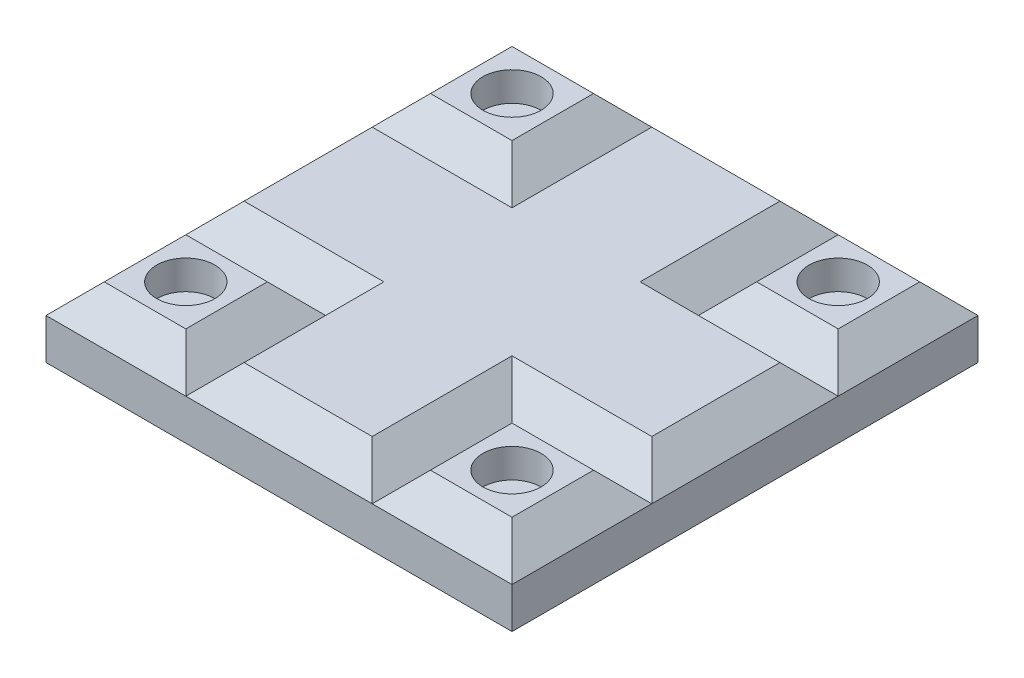
ISO-10303-21;
HEADER;
FILE_DESCRIPTION(('STEP AP214'),'2;1');
FILE_NAME('part.step','',(''),(''),'','','');
FILE_SCHEMA(('AUTOMOTIVE_DESIGN { 1 0 10303 214 1 1 1 1 }'));
ENDSEC;
DATA;
#1=APPLICATION_CONTEXT('core data for automotive mechanical design processes');
#2=APPLICATION_PROTOCOL_DEFINITION('international standard','automotive_design',2000,#1);
#3=PRODUCT_CONTEXT('',#1,'mechanical');
#4=PRODUCT('Part','Part','',(#3));
#5=PRODUCT_RELATED_PRODUCT_CATEGORY('part','',(#4));
#6=PRODUCT_DEFINITION_FORMATION('','',#4);
#7=PRODUCT_DEFINITION_CONTEXT('part definition',#1,'design');
#8=PRODUCT_DEFINITION('design','',#6,#7);
#9=PRODUCT_DEFINITION_SHAPE('','',#8);
#10=(LENGTH_UNIT() NAMED_UNIT(*) SI_UNIT(.MILLI.,.METRE.));
#11=(NAMED_UNIT(*) PLANE_ANGLE_UNIT() SI_UNIT($,.RADIAN.));
#12=(NAMED_UNIT(*) SI_UNIT($,.STERADIAN.) SOLID_ANGLE_UNIT());
#13=UNCERTAINTY_MEASURE_WITH_UNIT(LENGTH_MEASURE(1.E-05),#10,'distance_accuracy_value','');
#14=(GEOMETRIC_REPRESENTATION_CONTEXT(3) GLOBAL_UNCERTAINTY_ASSIGNED_CONTEXT((#13)) GLOBAL_UNIT_ASSIGNED_CONTEXT((#10,
#11,#12)) REPRESENTATION_CONTEXT('',''));
#15=CARTESIAN_POINT('',(0.,0.,0.));
#16=DIRECTION('',(0.,0.,1.));
#17=DIRECTION('',(1.,0.,0.));
#18=AXIS2_PLACEMENT_3D('',#15,#16,#17);
#19=CARTESIAN_POINT('',(-20.,6.,20.));
#20=DIRECTION('',(0.,0.,-1.));
#21=DIRECTION('',(-1.,0.,0.));
#22=AXIS2_PLACEMENT_3D('',#19,#20,#21);
#23=PLANE('',#22);
#24=DIRECTION('',(0.,-1.,0.));
#25=VECTOR('',#24,1.);
#26=CARTESIAN_POINT('',(20.,6.,20.));
#27=LINE('',#26,#25);
#28=CARTESIAN_POINT('',(20.,3.50000000000004,20.));
#29=VERTEX_POINT('',#28);
#30=CARTESIAN_POINT('',(20.,0.,20.));
#31=VERTEX_POINT('',#30);
#32=EDGE_CURVE('E271',#29,#31,#27,.T.);
#33=ORIENTED_EDGE('',*,*,#32,.F.);
#34=DIRECTION('',(-1.,0.,0.));
#35=VECTOR('',#34,1.);
#36=CARTESIAN_POINT('',(7.99999999999985,3.50000000000004,20.));
#37=LINE('',#36,#35);
#38=CARTESIAN_POINT('',(7.99999999999985,3.5,20.0000000000001));
#39=VERTEX_POINT('',#38);
#40=EDGE_CURVE('E411',#29,#39,#37,.T.);
#41=ORIENTED_EDGE('',*,*,#40,.T.);
#42=DIRECTION('',(-1.,0.,0.));
#43=VECTOR('',#42,1.);
#44=CARTESIAN_POINT('',(-7.99999999999978,3.5,20.));
#45=LINE('',#44,#43);
#46=CARTESIAN_POINT('',(-7.99999999999978,3.5,20.));
#47=VERTEX_POINT('',#46);
#48=EDGE_CURVE('E319',#39,#47,#45,.T.);
#49=ORIENTED_EDGE('',*,*,#48,.T.);
#50=DIRECTION('',(-1.,0.,0.));
#51=VECTOR('',#50,1.);
#52=CARTESIAN_POINT('',(-20.0000000000001,3.5000000000001,20.));
#53=LINE('',#52,#51);
#54=CARTESIAN_POINT('',(-20.,3.5000000000001,20.));
#55=VERTEX_POINT('',#54);
#56=EDGE_CURVE('E375',#47,#55,#53,.T.);
#57=ORIENTED_EDGE('',*,*,#56,.T.);
#58=DIRECTION('',(0.,-1.,0.));
#59=VECTOR('',#58,1.);
#60=CARTESIAN_POINT('',(-20.,6.,20.));
#61=LINE('',#60,#59);
#62=CARTESIAN_POINT('',(-20.,0.,20.));
#63=VERTEX_POINT('',#62);
#64=EDGE_CURVE('E262',#55,#63,#61,.T.);
#65=ORIENTED_EDGE('',*,*,#64,.T.);
#66=DIRECTION('',(1.,0.,0.));
#67=VECTOR('',#66,1.);
#68=CARTESIAN_POINT('',(-20.,0.,20.));
#69=LINE('',#68,#67);
#70=EDGE_CURVE('E242',#63,#31,#69,.T.);
#71=ORIENTED_EDGE('',*,*,#70,.T.);
#72=EDGE_LOOP('',(#33,#41,#49,#57,#65,#71));
#73=FACE_BOUND('',#72,.T.);
#74=ADVANCED_FACE('F38',(#73),#23,.F.);
#75=CARTESIAN_POINT('',(20.,6.,20.));
#76=DIRECTION('',(-1.,0.,0.));
#77=DIRECTION('',(0.,0.,1.));
#78=AXIS2_PLACEMENT_3D('',#75,#76,#77);
#79=PLANE('',#78);
#80=DIRECTION('',(0.,-1.,0.));
#81=VECTOR('',#80,1.);
#82=CARTESIAN_POINT('',(20.,6.,-20.));
#83=LINE('',#82,#81);
#84=CARTESIAN_POINT('',(20.,3.50000000000008,-20.));
#85=VERTEX_POINT('',#84);
#86=CARTESIAN_POINT('',(20.,0.,-20.));
#87=VERTEX_POINT('',#86);
#88=EDGE_CURVE('E268',#85,#87,#83,.T.);
#89=ORIENTED_EDGE('',*,*,#88,.F.);
#90=DIRECTION('',(0.,0.,1.));
#91=VECTOR('',#90,1.);
#92=CARTESIAN_POINT('',(20.,3.50000000000008,-7.99999999999979));
#93=LINE('',#92,#91);
#94=CARTESIAN_POINT('',(20.,3.5,-7.99999999999992));
#95=VERTEX_POINT('',#94);
#96=EDGE_CURVE('E444',#85,#95,#93,.T.);
#97=ORIENTED_EDGE('',*,*,#96,.T.);
#98=DIRECTION('',(0.,0.,1.));
#99=VECTOR('',#98,1.);
#100=CARTESIAN_POINT('',(20.,3.5,7.99999999999978));
#101=LINE('',#100,#99);
#102=CARTESIAN_POINT('',(20.0000000000002,3.5,7.99999999999978));
#103=VERTEX_POINT('',#102);
#104=EDGE_CURVE('E316',#95,#103,#101,.T.);
#105=ORIENTED_EDGE('',*,*,#104,.T.);
#106=DIRECTION('',(0.,0.,1.));
#107=VECTOR('',#106,1.);
#108=CARTESIAN_POINT('',(20.,3.50000000000004,20.));
#109=LINE('',#108,#107);
#110=EDGE_CURVE('E408',#103,#29,#109,.T.);
#111=ORIENTED_EDGE('',*,*,#110,.T.);
#112=ORIENTED_EDGE('',*,*,#32,.T.);
#113=DIRECTION('',(0.,0.,-1.));
#114=VECTOR('',#113,1.);
#115=CARTESIAN_POINT('',(20.,0.,20.));
#116=LINE('',#115,#114);
#117=EDGE_CURVE('E247',#31,#87,#116,.T.);
#118=ORIENTED_EDGE('',*,*,#117,.T.);
#119=EDGE_LOOP('',(#89,#97,#105,#111,#112,#118));
#120=FACE_BOUND('',#119,.T.);
#121=ADVANCED_FACE('F611',(#120),#79,.F.);
#122=CARTESIAN_POINT('',(-20.,6.,-20.));
#123=DIRECTION('',(0.,0.,-1.));
#124=DIRECTION('',(-1.,0.,0.));
#125=AXIS2_PLACEMENT_3D('',#122,#123,#124);
#126=PLANE('',#125);
#127=DIRECTION('',(0.,-1.,0.));
#128=VECTOR('',#127,1.);
#129=CARTESIAN_POINT('',(-20.,6.,-20.));
#130=LINE('',#129,#128);
#131=CARTESIAN_POINT('',(-20.,3.49999999999993,-20.));
#132=VERTEX_POINT('',#131);
#133=CARTESIAN_POINT('',(-20.,0.,-20.));
#134=VERTEX_POINT('',#133);
#135=EDGE_CURVE('E265',#132,#134,#130,.T.);
#136=ORIENTED_EDGE('',*,*,#135,.F.);
#137=DIRECTION('',(1.,0.,0.));
#138=VECTOR('',#137,1.);
#139=CARTESIAN_POINT('',(-20.,3.49999999999993,-20.));
#140=LINE('',#139,#138);
#141=CARTESIAN_POINT('',(-7.99999999999999,3.5,-20.));
#142=VERTEX_POINT('',#141);
#143=EDGE_CURVE('E11',#132,#142,#140,.T.);
#144=ORIENTED_EDGE('',*,*,#143,.T.);
#145=DIRECTION('',(1.,0.,0.));
#146=VECTOR('',#145,1.);
#147=CARTESIAN_POINT('',(-20.,3.5,-20.));
#148=LINE('',#147,#146);
#149=CARTESIAN_POINT('',(8.00000000000008,3.5,-20.));
#150=VERTEX_POINT('',#149);
#151=EDGE_CURVE('E313',#142,#150,#148,.T.);
#152=ORIENTED_EDGE('',*,*,#151,.T.);
#153=DIRECTION('',(1.,0.,0.));
#154=VECTOR('',#153,1.);
#155=CARTESIAN_POINT('',(-20.,3.50000000000008,-20.));
#156=LINE('',#155,#154);
#157=EDGE_CURVE('E441',#150,#85,#156,.T.);
#158=ORIENTED_EDGE('',*,*,#157,.T.);
#159=ORIENTED_EDGE('',*,*,#88,.T.);
#160=DIRECTION('',(1.,0.,0.));
#161=VECTOR('',#160,1.);
#162=CARTESIAN_POINT('',(-20.,0.,-20.));
#163=LINE('',#162,#161);
#164=EDGE_CURVE('E254',#134,#87,#163,.T.);
#165=ORIENTED_EDGE('',*,*,#164,.F.);
#166=EDGE_LOOP('',(#136,#144,#152,#158,#159,#165));
#167=FACE_BOUND('',#166,.T.);
#168=ADVANCED_FACE('F626',(#167),#126,.T.);
#169=CARTESIAN_POINT('',(-20.,6.,20.));
#170=DIRECTION('',(-1.,0.,0.));
#171=DIRECTION('',(0.,0.,1.));
#172=AXIS2_PLACEMENT_3D('',#169,#170,#171);
#173=PLANE('',#172);
#174=DIRECTION('',(0.,0.,-1.));
#175=VECTOR('',#174,1.);
#176=CARTESIAN_POINT('',(-20.,3.5,20.));
#177=LINE('',#176,#175);
#178=CARTESIAN_POINT('',(-20.0000000000001,3.5,7.99999999999979));
#179=VERTEX_POINT('',#178);
#180=CARTESIAN_POINT('',(-20.,3.5,-8.00000000000001));
#181=VERTEX_POINT('',#180);
#182=EDGE_CURVE('E274',#179,#181,#177,.T.);
#183=ORIENTED_EDGE('',*,*,#182,.T.);
#184=DIRECTION('',(0.,0.,-1.));
#185=VECTOR('',#184,1.);
#186=CARTESIAN_POINT('',(-20.,3.49999999999993,20.));
#187=LINE('',#186,#185);
#188=EDGE_CURVE('E49',#181,#132,#187,.T.);
#189=ORIENTED_EDGE('',*,*,#188,.T.);
#190=ORIENTED_EDGE('',*,*,#135,.T.);
#191=DIRECTION('',(0.,0.,-1.));
#192=VECTOR('',#191,1.);
#193=CARTESIAN_POINT('',(-20.,0.,20.));
#194=LINE('',#193,#192);
#195=EDGE_CURVE('E258',#63,#134,#194,.T.);
#196=ORIENTED_EDGE('',*,*,#195,.F.);
#197=ORIENTED_EDGE('',*,*,#64,.F.);
#198=DIRECTION('',(0.,0.,-1.));
#199=VECTOR('',#198,1.);
#200=CARTESIAN_POINT('',(-20.,3.5000000000001,20.));
#201=LINE('',#200,#199);
#202=EDGE_CURVE('E378',#55,#179,#201,.T.);
#203=ORIENTED_EDGE('',*,*,#202,.T.);
#204=EDGE_LOOP('',(#183,#189,#190,#196,#197,#203));
#205=FACE_BOUND('',#204,.T.);
#206=ADVANCED_FACE('F622',(#205),#173,.T.);
#207=CARTESIAN_POINT('',(0.,6.,0.));
#208=DIRECTION('',(0.,1.,0.));
#209=DIRECTION('',(0.,0.,1.));
#210=AXIS2_PLACEMENT_3D('',#207,#208,#209);
#211=PLANE('',#210);
#212=DIRECTION('',(-1.,0.,0.));
#213=VECTOR('',#212,1.);
#214=CARTESIAN_POINT('',(-20.,6.,-5.5));
#215=LINE('',#214,#213);
#216=CARTESIAN_POINT('',(-5.49999999999998,6.,-5.5));
#217=VERTEX_POINT('',#216);
#218=CARTESIAN_POINT('',(-17.5,6.,-5.5));
#219=VERTEX_POINT('',#218);
#220=EDGE_CURVE('E230',#217,#219,#215,.T.);
#221=ORIENTED_EDGE('',*,*,#220,.T.);
#222=DIRECTION('',(0.,0.,1.));
#223=VECTOR('',#222,1.);
#224=CARTESIAN_POINT('',(-17.5,6.,0.));
#225=LINE('',#224,#223);
#226=CARTESIAN_POINT('',(-17.5,6.,5.4999999999998));
#227=VERTEX_POINT('',#226);
#228=EDGE_CURVE('E309',#219,#227,#225,.T.);
#229=ORIENTED_EDGE('',*,*,#228,.T.);
#230=DIRECTION('',(1.,0.,0.));
#231=VECTOR('',#230,1.);
#232=CARTESIAN_POINT('',(-8.00000000000007,6.,5.4999999999999));
#233=LINE('',#232,#231);
#234=CARTESIAN_POINT('',(-5.50000000000015,6.,5.49999999999993));
#235=VERTEX_POINT('',#234);
#236=EDGE_CURVE('E277',#227,#235,#233,.T.);
#237=ORIENTED_EDGE('',*,*,#236,.T.);
#238=DIRECTION('',(0.,0.,1.));
#239=VECTOR('',#238,1.);
#240=CARTESIAN_POINT('',(-5.49999999999977,6.,19.9999999999999));
#241=LINE('',#240,#239);
#242=CARTESIAN_POINT('',(-5.49999999999983,6.,17.5));
#243=VERTEX_POINT('',#242);
#244=EDGE_CURVE('E280',#235,#243,#241,.T.);
#245=ORIENTED_EDGE('',*,*,#244,.T.);
#246=DIRECTION('',(1.,0.,0.));
#247=VECTOR('',#246,1.);
#248=CARTESIAN_POINT('',(8.00000000000022,6.,17.5));
#249=LINE('',#248,#247);
#250=CARTESIAN_POINT('',(5.50000000000015,6.,17.5));
#251=VERTEX_POINT('',#250);
#252=EDGE_CURVE('E283',#243,#251,#249,.T.);
#253=ORIENTED_EDGE('',*,*,#252,.T.);
#254=DIRECTION('',(0.,0.,-1.));
#255=VECTOR('',#254,1.);
#256=CARTESIAN_POINT('',(5.49999999999993,6.,8.00000000000012));
#257=LINE('',#256,#255);
#258=CARTESIAN_POINT('',(5.49999999999987,6.,5.50000000000012));
#259=VERTEX_POINT('',#258);
#260=EDGE_CURVE('E286',#251,#259,#257,.T.);
#261=ORIENTED_EDGE('',*,*,#260,.T.);
#262=DIRECTION('',(1.,0.,0.));
#263=VECTOR('',#262,1.);
#264=CARTESIAN_POINT('',(19.9999999999999,6.,5.49999999999977));
#265=LINE('',#264,#263);
#266=CARTESIAN_POINT('',(17.5,6.,5.49999999999983));
#267=VERTEX_POINT('',#266);
#268=EDGE_CURVE('E289',#259,#267,#265,.T.);
#269=ORIENTED_EDGE('',*,*,#268,.T.);
#270=DIRECTION('',(0.,0.,-1.));
#271=VECTOR('',#270,1.);
#272=CARTESIAN_POINT('',(17.5,6.,-7.99999999999992));
#273=LINE('',#272,#271);
#274=CARTESIAN_POINT('',(17.5,6.,-5.49999999999992));
#275=VERTEX_POINT('',#274);
#276=EDGE_CURVE('E292',#267,#275,#273,.T.);
#277=ORIENTED_EDGE('',*,*,#276,.T.);
#278=DIRECTION('',(-1.,0.,0.));
#279=VECTOR('',#278,1.);
#280=CARTESIAN_POINT('',(8.00000000000003,6.,-5.49999999999995));
#281=LINE('',#280,#279);
#282=CARTESIAN_POINT('',(5.50000000000002,6.,-5.49999999999996));
#283=VERTEX_POINT('',#282);
#284=EDGE_CURVE('E295',#275,#283,#281,.T.);
#285=ORIENTED_EDGE('',*,*,#284,.T.);
#286=DIRECTION('',(0.,0.,-1.));
#287=VECTOR('',#286,1.);
#288=CARTESIAN_POINT('',(5.50000000000007,6.,-20.));
#289=LINE('',#288,#287);
#290=CARTESIAN_POINT('',(5.50000000000006,6.,-17.5));
#291=VERTEX_POINT('',#290);
#292=EDGE_CURVE('E298',#283,#291,#289,.T.);
#293=ORIENTED_EDGE('',*,*,#292,.T.);
#294=DIRECTION('',(-1.,0.,0.));
#295=VECTOR('',#294,1.);
#296=CARTESIAN_POINT('',(0.,6.,-17.5));
#297=LINE('',#296,#295);
#298=CARTESIAN_POINT('',(-5.49999999999998,6.,-17.5));
#299=VERTEX_POINT('',#298);
#300=EDGE_CURVE('E301',#291,#299,#297,.T.);
#301=ORIENTED_EDGE('',*,*,#300,.T.);
#302=DIRECTION('',(0.,0.,1.));
#303=VECTOR('',#302,1.);
#304=CARTESIAN_POINT('',(-5.49999999999998,6.,-8.00000000000001));
#305=LINE('',#304,#303);
#306=EDGE_CURVE('E304',#299,#217,#305,.T.);
#307=ORIENTED_EDGE('',*,*,#306,.T.);
#308=EDGE_LOOP('',(#221,#229,#237,#245,#253,#261,#269,#277,#285,#293,#301,#307));
#309=FACE_BOUND('',#308,.T.);
#310=ADVANCED_FACE('F779',(#309),#211,.T.);
#311=CARTESIAN_POINT('',(0.,0.,0.));
#312=DIRECTION('',(0.,1.,0.));
#313=DIRECTION('',(0.,0.,1.));
#314=AXIS2_PLACEMENT_3D('',#311,#312,#313);
#315=PLANE('',#314);
#316=ORIENTED_EDGE('',*,*,#70,.F.);
#317=ORIENTED_EDGE('',*,*,#195,.T.);
#318=ORIENTED_EDGE('',*,*,#164,.T.);
#319=ORIENTED_EDGE('',*,*,#117,.F.);
#320=EDGE_LOOP('',(#316,#317,#318,#319));
#321=FACE_BOUND('',#320,.T.);
#322=ADVANCED_FACE('F621',(#321),#315,.F.);
#323=CARTESIAN_POINT('',(17.5,6.,0.));
#324=DIRECTION('',(0.707106781186547,0.707106781186549,0.));
#325=DIRECTION('',(0.,0.,1.));
#326=AXIS2_PLACEMENT_3D('',#323,#324,#325);
#327=PLANE('',#326);
#328=DIRECTION('',(-0.577350269189627,0.577350269189625,0.577350269189625));
#329=VECTOR('',#328,1.);
#330=CARTESIAN_POINT('',(15.6666666666667,7.8333333333333,-3.66666666666662));
#331=LINE('',#330,#329);
#332=EDGE_CURVE('E354',#275,#95,#331,.F.);
#333=ORIENTED_EDGE('',*,*,#332,.F.);
#334=ORIENTED_EDGE('',*,*,#276,.F.);
#335=DIRECTION('',(-0.577350269189631,0.577350269189629,-0.577350269189618));
#336=VECTOR('',#335,1.);
#337=CARTESIAN_POINT('',(20.0000000000002,3.5,7.99999999999978));
#338=LINE('',#337,#336);
#339=EDGE_CURVE('E358',#103,#267,#338,.T.);
#340=ORIENTED_EDGE('',*,*,#339,.F.);
#341=ORIENTED_EDGE('',*,*,#104,.F.);
#342=EDGE_LOOP('',(#333,#334,#340,#341));
#343=FACE_BOUND('',#342,.T.);
#344=ADVANCED_FACE('F656',(#343),#327,.T.);
#345=CARTESIAN_POINT('',(20.0000000000002,3.5,7.99999999999978));
#346=DIRECTION('',(0.,0.707106781186549,0.707106781186546));
#347=DIRECTION('',(1.,0.,0.));
#348=AXIS2_PLACEMENT_3D('',#345,#346,#347);
#349=PLANE('',#348);
#350=ORIENTED_EDGE('',*,*,#339,.T.);
#351=ORIENTED_EDGE('',*,*,#268,.F.);
#352=DIRECTION('',(-0.57735026918964,0.577350269189624,-0.577350269189613));
#353=VECTOR('',#352,1.);
#354=CARTESIAN_POINT('',(12.0000000000001,-0.500000000000088,12.0000000000001));
#355=LINE('',#354,#353);
#356=CARTESIAN_POINT('',(7.99999999999994,3.5,8.00000000000007));
#357=VERTEX_POINT('',#356);
#358=EDGE_CURVE('E350',#357,#259,#355,.T.);
#359=ORIENTED_EDGE('',*,*,#358,.F.);
#360=DIRECTION('',(-1.,0.,0.));
#361=VECTOR('',#360,1.);
#362=CARTESIAN_POINT('',(20.0000000000002,3.5,7.99999999999978));
#363=LINE('',#362,#361);
#364=EDGE_CURVE('E516',#103,#357,#363,.T.);
#365=ORIENTED_EDGE('',*,*,#364,.F.);
#366=EDGE_LOOP('',(#350,#351,#359,#365));
#367=FACE_BOUND('',#366,.T.);
#368=ADVANCED_FACE('F659',(#367),#349,.T.);
#369=CARTESIAN_POINT('',(20.,3.5,-7.99999999999992));
#370=DIRECTION('',(0.,0.707106781186549,-0.707106781186546));
#371=DIRECTION('',(-1.,0.,0.));
#372=AXIS2_PLACEMENT_3D('',#369,#370,#371);
#373=PLANE('',#372);
#374=ORIENTED_EDGE('',*,*,#332,.T.);
#375=DIRECTION('',(1.,0.,0.));
#376=VECTOR('',#375,1.);
#377=CARTESIAN_POINT('',(20.,3.5,-7.99999999999992));
#378=LINE('',#377,#376);
#379=CARTESIAN_POINT('',(7.99999999999978,3.5,-7.99999999999979));
#380=VERTEX_POINT('',#379);
#381=EDGE_CURVE('E224',#380,#95,#378,.T.);
#382=ORIENTED_EDGE('',*,*,#381,.F.);
#383=DIRECTION('',(-0.577350269189629,0.577350269189624,0.577350269189625));
#384=VECTOR('',#383,1.);
#385=CARTESIAN_POINT('',(12.0000000000001,-0.499999999999994,-12.));
#386=LINE('',#385,#384);
#387=EDGE_CURVE('E346',#283,#380,#386,.F.);
#388=ORIENTED_EDGE('',*,*,#387,.F.);
#389=ORIENTED_EDGE('',*,*,#284,.F.);
#390=EDGE_LOOP('',(#374,#382,#388,#389));
#391=FACE_BOUND('',#390,.T.);
#392=ADVANCED_FACE('F652',(#391),#373,.T.);
#393=CARTESIAN_POINT('',(8.00000000000022,3.5,19.9999999999998));
#394=DIRECTION('',(0.707106781186546,0.707106781186549,0.));
#395=DIRECTION('',(0.,0.,-1.));
#396=AXIS2_PLACEMENT_3D('',#393,#394,#395);
#397=PLANE('',#396);
#398=ORIENTED_EDGE('',*,*,#358,.T.);
#399=ORIENTED_EDGE('',*,*,#260,.F.);
#400=DIRECTION('',(-0.577350269189636,0.57735026918962,-0.577350269189622));
#401=VECTOR('',#400,1.);
#402=CARTESIAN_POINT('',(3.66666666666671,7.8333333333334,15.6666666666666));
#403=LINE('',#402,#401);
#404=EDGE_CURVE('E342',#39,#251,#403,.T.);
#405=ORIENTED_EDGE('',*,*,#404,.F.);
#406=DIRECTION('',(0.,0.,1.));
#407=VECTOR('',#406,1.);
#408=CARTESIAN_POINT('',(8.00000000000022,3.5,19.9999999999998));
#409=LINE('',#408,#407);
#410=EDGE_CURVE('E520',#357,#39,#409,.T.);
#411=ORIENTED_EDGE('',*,*,#410,.F.);
#412=EDGE_LOOP('',(#398,#399,#405,#411));
#413=FACE_BOUND('',#412,.T.);
#414=ADVANCED_FACE('F663',(#413),#397,.T.);
#415=CARTESIAN_POINT('',(8.00000000000008,3.5,-20.));
#416=DIRECTION('',(0.707106781186546,0.707106781186549,0.));
#417=DIRECTION('',(0.,0.,-1.));
#418=AXIS2_PLACEMENT_3D('',#415,#416,#417);
#419=PLANE('',#418);
#420=ORIENTED_EDGE('',*,*,#387,.T.);
#421=DIRECTION('',(0.,0.,1.));
#422=VECTOR('',#421,1.);
#423=CARTESIAN_POINT('',(8.00000000000008,3.5,-20.));
#424=LINE('',#423,#422);
#425=EDGE_CURVE('E525',#150,#380,#424,.T.);
#426=ORIENTED_EDGE('',*,*,#425,.F.);
#427=DIRECTION('',(0.577350269189628,-0.577350269189624,-0.577350269189626));
#428=VECTOR('',#427,1.);
#429=CARTESIAN_POINT('',(8.00000000000008,3.5,-20.));
#430=LINE('',#429,#428);
#431=EDGE_CURVE('E338',#291,#150,#430,.T.);
#432=ORIENTED_EDGE('',*,*,#431,.F.);
#433=ORIENTED_EDGE('',*,*,#292,.F.);
#434=EDGE_LOOP('',(#420,#426,#432,#433));
#435=FACE_BOUND('',#434,.T.);
#436=ADVANCED_FACE('F649',(#435),#419,.T.);
#437=CARTESIAN_POINT('',(0.,6.,17.5));
#438=DIRECTION('',(0.,0.707106781186549,0.707106781186547));
#439=DIRECTION('',(-1.,0.,0.));
#440=AXIS2_PLACEMENT_3D('',#437,#438,#439);
#441=PLANE('',#440);
#442=ORIENTED_EDGE('',*,*,#404,.T.);
#443=ORIENTED_EDGE('',*,*,#252,.F.);
#444=DIRECTION('',(0.577350269189616,0.57735026918963,-0.577350269189631));
#445=VECTOR('',#444,1.);
#446=CARTESIAN_POINT('',(-7.99999999999978,3.5,20.));
#447=LINE('',#446,#445);
#448=EDGE_CURVE('E334',#47,#243,#447,.T.);
#449=ORIENTED_EDGE('',*,*,#448,.F.);
#450=ORIENTED_EDGE('',*,*,#48,.F.);
#451=EDGE_LOOP('',(#442,#443,#449,#450));
#452=FACE_BOUND('',#451,.T.);
#453=ADVANCED_FACE('F666',(#452),#441,.T.);
#454=CARTESIAN_POINT('',(-20.,3.5,-20.));
#455=DIRECTION('',(0.,-0.707106781186549,0.707106781186547));
#456=DIRECTION('',(1.,0.,0.));
#457=AXIS2_PLACEMENT_3D('',#454,#455,#456);
#458=PLANE('',#457);
#459=ORIENTED_EDGE('',*,*,#431,.T.);
#460=ORIENTED_EDGE('',*,*,#151,.F.);
#461=DIRECTION('',(-0.577350269189627,-0.577350269189625,-0.577350269189626));
#462=VECTOR('',#461,1.);
#463=CARTESIAN_POINT('',(-12.,-0.5,-24.));
#464=LINE('',#463,#462);
#465=EDGE_CURVE('E240',#299,#142,#464,.T.);
#466=ORIENTED_EDGE('',*,*,#465,.F.);
#467=ORIENTED_EDGE('',*,*,#300,.F.);
#468=EDGE_LOOP('',(#459,#460,#466,#467));
#469=FACE_BOUND('',#468,.T.);
#470=ADVANCED_FACE('F741',(#469),#458,.F.);
#471=CARTESIAN_POINT('',(-7.99999999999978,3.5,20.));
#472=DIRECTION('',(-0.707106781186546,0.707106781186549,0.));
#473=DIRECTION('',(0.,0.,1.));
#474=AXIS2_PLACEMENT_3D('',#471,#472,#473);
#475=PLANE('',#474);
#476=ORIENTED_EDGE('',*,*,#448,.T.);
#477=ORIENTED_EDGE('',*,*,#244,.F.);
#478=DIRECTION('',(0.577350269189618,0.577350269189631,-0.577350269189628));
#479=VECTOR('',#478,1.);
#480=CARTESIAN_POINT('',(-12.,-0.499999999999974,11.9999999999999));
#481=LINE('',#480,#479);
#482=CARTESIAN_POINT('',(-8.00000000000009,3.5,7.99999999999991));
#483=VERTEX_POINT('',#482);
#484=EDGE_CURVE('E234',#483,#235,#481,.T.);
#485=ORIENTED_EDGE('',*,*,#484,.F.);
#486=DIRECTION('',(0.,0.,-1.));
#487=VECTOR('',#486,1.);
#488=CARTESIAN_POINT('',(-7.99999999999978,3.5,20.));
#489=LINE('',#488,#487);
#490=EDGE_CURVE('E362',#47,#483,#489,.T.);
#491=ORIENTED_EDGE('',*,*,#490,.F.);
#492=EDGE_LOOP('',(#476,#477,#485,#491));
#493=FACE_BOUND('',#492,.T.);
#494=ADVANCED_FACE('F735',(#493),#475,.T.);
#495=CARTESIAN_POINT('',(-7.99999999999999,3.5,-20.));
#496=DIRECTION('',(-0.707106781186546,0.707106781186549,0.));
#497=DIRECTION('',(0.,0.,1.));
#498=AXIS2_PLACEMENT_3D('',#495,#496,#497);
#499=PLANE('',#498);
#500=ORIENTED_EDGE('',*,*,#465,.T.);
#501=DIRECTION('',(0.,0.,-1.));
#502=VECTOR('',#501,1.);
#503=CARTESIAN_POINT('',(-7.99999999999999,3.5,-20.));
#504=LINE('',#503,#502);
#505=CARTESIAN_POINT('',(-7.99999999999987,3.5,-7.99999999999969));
#506=VERTEX_POINT('',#505);
#507=EDGE_CURVE('E207',#506,#142,#504,.T.);
#508=ORIENTED_EDGE('',*,*,#507,.F.);
#509=DIRECTION('',(0.577350269189627,0.577350269189624,0.577350269189627));
#510=VECTOR('',#509,1.);
#511=CARTESIAN_POINT('',(-12.,-0.499999999999995,-12.));
#512=LINE('',#511,#510);
#513=EDGE_CURVE('E228',#217,#506,#512,.F.);
#514=ORIENTED_EDGE('',*,*,#513,.F.);
#515=ORIENTED_EDGE('',*,*,#306,.F.);
#516=EDGE_LOOP('',(#500,#508,#514,#515));
#517=FACE_BOUND('',#516,.T.);
#518=ADVANCED_FACE('F238',(#517),#499,.T.);
#519=CARTESIAN_POINT('',(-20.0000000000001,3.5,7.99999999999979));
#520=DIRECTION('',(0.,0.707106781186549,0.707106781186546));
#521=DIRECTION('',(1.,0.,0.));
#522=AXIS2_PLACEMENT_3D('',#519,#520,#521);
#523=PLANE('',#522);
#524=ORIENTED_EDGE('',*,*,#484,.T.);
#525=ORIENTED_EDGE('',*,*,#236,.F.);
#526=DIRECTION('',(0.577350269189628,0.577350269189627,-0.577350269189623));
#527=VECTOR('',#526,1.);
#528=CARTESIAN_POINT('',(-20.0000000000001,3.5,7.99999999999979));
#529=LINE('',#528,#527);
#530=EDGE_CURVE('E235',#179,#227,#529,.T.);
#531=ORIENTED_EDGE('',*,*,#530,.F.);
#532=DIRECTION('',(-1.,0.,0.));
#533=VECTOR('',#532,1.);
#534=CARTESIAN_POINT('',(-20.0000000000001,3.5,7.99999999999979));
#535=LINE('',#534,#533);
#536=EDGE_CURVE('E511',#483,#179,#535,.T.);
#537=ORIENTED_EDGE('',*,*,#536,.F.);
#538=EDGE_LOOP('',(#524,#525,#531,#537));
#539=FACE_BOUND('',#538,.T.);
#540=ADVANCED_FACE('F695',(#539),#523,.T.);
#541=CARTESIAN_POINT('',(-20.,3.5,-8.00000000000001));
#542=DIRECTION('',(0.,0.707106781186549,-0.707106781186546));
#543=DIRECTION('',(-1.,0.,0.));
#544=AXIS2_PLACEMENT_3D('',#541,#542,#543);
#545=PLANE('',#544);
#546=ORIENTED_EDGE('',*,*,#513,.T.);
#547=DIRECTION('',(1.,0.,0.));
#548=VECTOR('',#547,1.);
#549=CARTESIAN_POINT('',(-20.,3.5,-8.00000000000001));
#550=LINE('',#549,#548);
#551=EDGE_CURVE('E217',#181,#506,#550,.T.);
#552=ORIENTED_EDGE('',*,*,#551,.F.);
#553=DIRECTION('',(-0.577350269189626,-0.577350269189625,-0.577350269189627));
#554=VECTOR('',#553,1.);
#555=CARTESIAN_POINT('',(-20.,3.5,-8.00000000000001));
#556=LINE('',#555,#554);
#557=EDGE_CURVE('E323',#219,#181,#556,.T.);
#558=ORIENTED_EDGE('',*,*,#557,.F.);
#559=ORIENTED_EDGE('',*,*,#220,.F.);
#560=EDGE_LOOP('',(#546,#552,#558,#559));
#561=FACE_BOUND('',#560,.T.);
#562=ADVANCED_FACE('F229',(#561),#545,.T.);
#563=CARTESIAN_POINT('',(-20.,3.5,20.));
#564=DIRECTION('',(0.707106781186547,-0.707106781186549,0.));
#565=DIRECTION('',(0.,0.,-1.));
#566=AXIS2_PLACEMENT_3D('',#563,#564,#565);
#567=PLANE('',#566);
#568=ORIENTED_EDGE('',*,*,#530,.T.);
#569=ORIENTED_EDGE('',*,*,#228,.F.);
#570=ORIENTED_EDGE('',*,*,#557,.T.);
#571=ORIENTED_EDGE('',*,*,#182,.F.);
#572=EDGE_LOOP('',(#568,#569,#570,#571));
#573=FACE_BOUND('',#572,.T.);
#574=ADVANCED_FACE('F690',(#573),#567,.F.);
#575=CARTESIAN_POINT('',(0.,6.,0.));
#576=DIRECTION('',(0.,1.,0.));
#577=DIRECTION('',(0.,0.,1.));
#578=AXIS2_PLACEMENT_3D('',#575,#576,#577);
#579=PLANE('',#578);
#580=CARTESIAN_POINT('',(-13.9999999999999,6.,13.9999999999999));
#581=DIRECTION('',(0.,1.,0.));
#582=DIRECTION('',(0.,0.,1.));
#583=AXIS2_PLACEMENT_3D('',#580,#581,#582);
#584=CIRCLE('',#583,2.5);
#585=CARTESIAN_POINT('',(-13.9999999999999,6.,16.4999999999999));
#586=VERTEX_POINT('',#585);
#587=EDGE_CURVE('E539',#586,#586,#584,.T.);
#588=ORIENTED_EDGE('',*,*,#587,.F.);
#589=EDGE_LOOP('',(#588));
#590=FACE_BOUND('',#589,.T.);
#591=DIRECTION('',(0.,0.,-1.));
#592=VECTOR('',#591,1.);
#593=CARTESIAN_POINT('',(-10.4999999999997,6.,7.99999999999979));
#594=LINE('',#593,#592);
#595=CARTESIAN_POINT('',(-10.4999999999997,6.,17.5000000000001));
#596=VERTEX_POINT('',#595);
#597=CARTESIAN_POINT('',(-10.4999999999997,6.,10.4999999999997));
#598=VERTEX_POINT('',#597);
#599=EDGE_CURVE('E368',#596,#598,#594,.T.);
#600=ORIENTED_EDGE('',*,*,#599,.T.);
#601=DIRECTION('',(-1.,0.,0.));
#602=VECTOR('',#601,1.);
#603=CARTESIAN_POINT('',(-20.0000000000001,6.,10.4999999999997));
#604=LINE('',#603,#602);
#605=CARTESIAN_POINT('',(-17.5000000000001,6.,10.4999999999997));
#606=VERTEX_POINT('',#605);
#607=EDGE_CURVE('E371',#598,#606,#604,.T.);
#608=ORIENTED_EDGE('',*,*,#607,.T.);
#609=DIRECTION('',(0.,0.,1.));
#610=VECTOR('',#609,1.);
#611=CARTESIAN_POINT('',(-17.5000000000001,6.,0.));
#612=LINE('',#611,#610);
#613=CARTESIAN_POINT('',(-17.5000000000001,6.,17.5000000000001));
#614=VERTEX_POINT('',#613);
#615=EDGE_CURVE('E322',#606,#614,#612,.T.);
#616=ORIENTED_EDGE('',*,*,#615,.T.);
#617=DIRECTION('',(1.,0.,0.));
#618=VECTOR('',#617,1.);
#619=CARTESIAN_POINT('',(-7.99999999999978,6.,17.5000000000001));
#620=LINE('',#619,#618);
#621=EDGE_CURVE('E365',#614,#596,#620,.T.);
#622=ORIENTED_EDGE('',*,*,#621,.T.);
#623=EDGE_LOOP('',(#600,#608,#616,#622));
#624=FACE_BOUND('',#623,.T.);
#625=ADVANCED_FACE('F682',(#590,#624),#579,.T.);
#626=CARTESIAN_POINT('',(0.,6.,17.5000000000001));
#627=DIRECTION('',(0.,0.707106781186545,0.707106781186549));
#628=DIRECTION('',(-1.,0.,0.));
#629=AXIS2_PLACEMENT_3D('',#626,#627,#628);
#630=PLANE('',#629);
#631=DIRECTION('',(-0.577350269189625,-0.577350269189628,0.577350269189625));
#632=VECTOR('',#631,1.);
#633=CARTESIAN_POINT('',(-11.6666666666668,11.8333333333334,11.6666666666668));
#634=LINE('',#633,#632);
#635=EDGE_CURVE('E389',#55,#614,#634,.F.);
#636=ORIENTED_EDGE('',*,*,#635,.F.);
#637=ORIENTED_EDGE('',*,*,#56,.F.);
#638=DIRECTION('',(-0.577350269189625,0.577350269189628,-0.577350269189625));
#639=VECTOR('',#638,1.);
#640=CARTESIAN_POINT('',(-6.99999999999979,2.5000000000001,21.));
#641=LINE('',#640,#639);
#642=EDGE_CURVE('E326',#596,#47,#641,.F.);
#643=ORIENTED_EDGE('',*,*,#642,.F.);
#644=ORIENTED_EDGE('',*,*,#621,.F.);
#645=EDGE_LOOP('',(#636,#637,#643,#644));
#646=FACE_BOUND('',#645,.T.);
#647=ADVANCED_FACE('F672',(#646),#630,.T.);
#648=CARTESIAN_POINT('',(-10.4999999999997,6.,0.));
#649=DIRECTION('',(0.707106781186549,0.707106781186545,0.));
#650=DIRECTION('',(0.,0.,1.));
#651=AXIS2_PLACEMENT_3D('',#648,#649,#650);
#652=PLANE('',#651);
#653=ORIENTED_EDGE('',*,*,#642,.T.);
#654=ORIENTED_EDGE('',*,*,#490,.T.);
#655=DIRECTION('',(-0.577350269189625,0.577350269189628,0.577350269189625));
#656=VECTOR('',#655,1.);
#657=CARTESIAN_POINT('',(-6.99999999999979,2.5000000000001,6.9999999999998));
#658=LINE('',#657,#656);
#659=EDGE_CURVE('E385',#598,#483,#658,.F.);
#660=ORIENTED_EDGE('',*,*,#659,.F.);
#661=ORIENTED_EDGE('',*,*,#599,.F.);
#662=EDGE_LOOP('',(#653,#654,#660,#661));
#663=FACE_BOUND('',#662,.T.);
#664=ADVANCED_FACE('F677',(#663),#652,.T.);
#665=CARTESIAN_POINT('',(-17.5000000000001,6.,0.));
#666=DIRECTION('',(0.707106781186549,-0.707106781186545,0.));
#667=DIRECTION('',(0.,0.,1.));
#668=AXIS2_PLACEMENT_3D('',#665,#666,#667);
#669=PLANE('',#668);
#670=ORIENTED_EDGE('',*,*,#635,.T.);
#671=ORIENTED_EDGE('',*,*,#615,.F.);
#672=DIRECTION('',(0.577350269189625,0.577350269189628,0.577350269189625));
#673=VECTOR('',#672,1.);
#674=CARTESIAN_POINT('',(-21.,2.5000000000001,6.9999999999998));
#675=LINE('',#674,#673);
#676=EDGE_CURVE('E382',#179,#606,#675,.T.);
#677=ORIENTED_EDGE('',*,*,#676,.F.);
#678=ORIENTED_EDGE('',*,*,#202,.F.);
#679=EDGE_LOOP('',(#670,#671,#677,#678));
#680=FACE_BOUND('',#679,.T.);
#681=ADVANCED_FACE('F685',(#680),#669,.F.);
#682=CARTESIAN_POINT('',(0.,6.,10.4999999999997));
#683=DIRECTION('',(0.,0.707106781186545,-0.707106781186549));
#684=DIRECTION('',(1.,0.,0.));
#685=AXIS2_PLACEMENT_3D('',#682,#683,#684);
#686=PLANE('',#685);
#687=ORIENTED_EDGE('',*,*,#659,.T.);
#688=ORIENTED_EDGE('',*,*,#536,.T.);
#689=ORIENTED_EDGE('',*,*,#676,.T.);
#690=ORIENTED_EDGE('',*,*,#607,.F.);
#691=EDGE_LOOP('',(#687,#688,#689,#690));
#692=FACE_BOUND('',#691,.T.);
#693=ADVANCED_FACE('F585',(#692),#686,.T.);
#694=CARTESIAN_POINT('',(0.,6.,0.));
#695=DIRECTION('',(0.,1.,0.));
#696=DIRECTION('',(1.,0.,0.));
#697=AXIS2_PLACEMENT_3D('',#694,#695,#696);
#698=PLANE('',#697);
#699=CARTESIAN_POINT('',(13.9999999999999,6.,13.9999999999998));
#700=DIRECTION('',(0.,1.,0.));
#701=DIRECTION('',(1.,0.,0.));
#702=AXIS2_PLACEMENT_3D('',#699,#700,#701);
#703=CIRCLE('',#702,2.5);
#704=CARTESIAN_POINT('',(16.4999999999999,6.,13.9999999999998));
#705=VERTEX_POINT('',#704);
#706=EDGE_CURVE('E563',#705,#705,#703,.T.);
#707=ORIENTED_EDGE('',*,*,#706,.F.);
#708=EDGE_LOOP('',(#707));
#709=FACE_BOUND('',#708,.T.);
#710=DIRECTION('',(-1.,0.,0.));
#711=VECTOR('',#710,1.);
#712=CARTESIAN_POINT('',(7.99999999999982,6.,10.4999999999997));
#713=LINE('',#712,#711);
#714=CARTESIAN_POINT('',(17.5000000000001,6.,10.4999999999997));
#715=VERTEX_POINT('',#714);
#716=CARTESIAN_POINT('',(10.4999999999998,6.,10.4999999999997));
#717=VERTEX_POINT('',#716);
#718=EDGE_CURVE('E401',#715,#717,#713,.T.);
#719=ORIENTED_EDGE('',*,*,#718,.T.);
#720=DIRECTION('',(0.,0.,1.));
#721=VECTOR('',#720,1.);
#722=CARTESIAN_POINT('',(10.4999999999998,6.,20.0000000000001));
#723=LINE('',#722,#721);
#724=CARTESIAN_POINT('',(10.4999999999998,6.,17.5));
#725=VERTEX_POINT('',#724);
#726=EDGE_CURVE('E404',#717,#725,#723,.T.);
#727=ORIENTED_EDGE('',*,*,#726,.T.);
#728=DIRECTION('',(1.,0.,0.));
#729=VECTOR('',#728,1.);
#730=CARTESIAN_POINT('',(20.0000000000001,6.,17.5));
#731=LINE('',#730,#729);
#732=CARTESIAN_POINT('',(17.5000000000001,6.,17.5));
#733=VERTEX_POINT('',#732);
#734=EDGE_CURVE('E381',#725,#733,#731,.T.);
#735=ORIENTED_EDGE('',*,*,#734,.T.);
#736=DIRECTION('',(0.,0.,-1.));
#737=VECTOR('',#736,1.);
#738=CARTESIAN_POINT('',(17.5000000000001,6.,7.99999999999971));
#739=LINE('',#738,#737);
#740=EDGE_CURVE('E398',#733,#715,#739,.T.);
#741=ORIENTED_EDGE('',*,*,#740,.T.);
#742=EDGE_LOOP('',(#719,#727,#735,#741));
#743=FACE_BOUND('',#742,.T.);
#744=ADVANCED_FACE('F581',(#709,#743),#698,.T.);
#745=CARTESIAN_POINT('',(0.,6.,0.));
#746=DIRECTION('',(0.,1.,0.));
#747=DIRECTION('',(0.,0.,-1.));
#748=AXIS2_PLACEMENT_3D('',#745,#746,#747);
#749=PLANE('',#748);
#750=CARTESIAN_POINT('',(13.9999999999999,6.,-13.9999999999999));
#751=DIRECTION('',(0.,1.,0.));
#752=DIRECTION('',(0.,0.,-1.));
#753=AXIS2_PLACEMENT_3D('',#750,#751,#752);
#754=CIRCLE('',#753,2.5);
#755=CARTESIAN_POINT('',(13.9999999999999,6.,-16.4999999999999));
#756=VERTEX_POINT('',#755);
#757=EDGE_CURVE('E555',#756,#756,#754,.T.);
#758=ORIENTED_EDGE('',*,*,#757,.F.);
#759=EDGE_LOOP('',(#758));
#760=FACE_BOUND('',#759,.T.);
#761=DIRECTION('',(0.,0.,1.));
#762=VECTOR('',#761,1.);
#763=CARTESIAN_POINT('',(10.4999999999997,6.,-7.99999999999979));
#764=LINE('',#763,#762);
#765=CARTESIAN_POINT('',(10.4999999999997,6.,-17.5000000000001));
#766=VERTEX_POINT('',#765);
#767=CARTESIAN_POINT('',(10.4999999999997,6.,-10.4999999999997));
#768=VERTEX_POINT('',#767);
#769=EDGE_CURVE('E434',#766,#768,#764,.T.);
#770=ORIENTED_EDGE('',*,*,#769,.T.);
#771=DIRECTION('',(1.,0.,0.));
#772=VECTOR('',#771,1.);
#773=CARTESIAN_POINT('',(20.0000000000001,6.,-10.4999999999997));
#774=LINE('',#773,#772);
#775=CARTESIAN_POINT('',(17.5000000000001,6.,-10.4999999999997));
#776=VERTEX_POINT('',#775);
#777=EDGE_CURVE('E437',#768,#776,#774,.T.);
#778=ORIENTED_EDGE('',*,*,#777,.T.);
#779=DIRECTION('',(0.,0.,-1.));
#780=VECTOR('',#779,1.);
#781=CARTESIAN_POINT('',(17.5000000000001,6.,-20.));
#782=LINE('',#781,#780);
#783=CARTESIAN_POINT('',(17.5000000000001,6.,-17.5000000000001));
#784=VERTEX_POINT('',#783);
#785=EDGE_CURVE('E414',#776,#784,#782,.T.);
#786=ORIENTED_EDGE('',*,*,#785,.T.);
#787=DIRECTION('',(-1.,0.,0.));
#788=VECTOR('',#787,1.);
#789=CARTESIAN_POINT('',(0.,6.,-17.5000000000001));
#790=LINE('',#789,#788);
#791=EDGE_CURVE('E431',#784,#766,#790,.T.);
#792=ORIENTED_EDGE('',*,*,#791,.T.);
#793=EDGE_LOOP('',(#770,#778,#786,#792));
#794=FACE_BOUND('',#793,.T.);
#795=ADVANCED_FACE('F584',(#760,#794),#749,.T.);
#796=CARTESIAN_POINT('',(0.,6.,0.));
#797=DIRECTION('',(0.,1.,0.));
#798=DIRECTION('',(-1.,0.,0.));
#799=AXIS2_PLACEMENT_3D('',#796,#797,#798);
#800=PLANE('',#799);
#801=CARTESIAN_POINT('',(-14.,6.,-13.9999999999997));
#802=DIRECTION('',(0.,1.,0.));
#803=DIRECTION('',(-1.,0.,0.));
#804=AXIS2_PLACEMENT_3D('',#801,#802,#803);
#805=CIRCLE('',#804,2.5);
#806=CARTESIAN_POINT('',(-16.5,6.,-13.9999999999997));
#807=VERTEX_POINT('',#806);
#808=EDGE_CURVE('E547',#807,#807,#805,.T.);
#809=ORIENTED_EDGE('',*,*,#808,.F.);
#810=EDGE_LOOP('',(#809));
#811=FACE_BOUND('',#810,.T.);
#812=DIRECTION('',(1.,0.,0.));
#813=VECTOR('',#812,1.);
#814=CARTESIAN_POINT('',(-7.9999999999999,6.,-10.4999999999998));
#815=LINE('',#814,#813);
#816=CARTESIAN_POINT('',(-17.4999999999999,6.,-10.4999999999997));
#817=VERTEX_POINT('',#816);
#818=CARTESIAN_POINT('',(-10.5,6.,-10.4999999999997));
#819=VERTEX_POINT('',#818);
#820=EDGE_CURVE('E64',#817,#819,#815,.T.);
#821=ORIENTED_EDGE('',*,*,#820,.T.);
#822=DIRECTION('',(0.,0.,-1.));
#823=VECTOR('',#822,1.);
#824=CARTESIAN_POINT('',(-10.5000000000001,6.,-20.));
#825=LINE('',#824,#823);
#826=CARTESIAN_POINT('',(-10.5,6.,-17.5));
#827=VERTEX_POINT('',#826);
#828=EDGE_CURVE('E209',#819,#827,#825,.T.);
#829=ORIENTED_EDGE('',*,*,#828,.T.);
#830=DIRECTION('',(-1.,0.,0.));
#831=VECTOR('',#830,1.);
#832=CARTESIAN_POINT('',(0.,6.,-17.5));
#833=LINE('',#832,#831);
#834=CARTESIAN_POINT('',(-17.4999999999999,6.,-17.5));
#835=VERTEX_POINT('',#834);
#836=EDGE_CURVE('E447',#827,#835,#833,.T.);
#837=ORIENTED_EDGE('',*,*,#836,.T.);
#838=DIRECTION('',(0.,0.,1.));
#839=VECTOR('',#838,1.);
#840=CARTESIAN_POINT('',(-17.4999999999999,6.,0.));
#841=LINE('',#840,#839);
#842=EDGE_CURVE('E463',#835,#817,#841,.T.);
#843=ORIENTED_EDGE('',*,*,#842,.T.);
#844=EDGE_LOOP('',(#821,#829,#837,#843));
#845=FACE_BOUND('',#844,.T.);
#846=ADVANCED_FACE('F930',(#811,#845),#800,.T.);
#847=CARTESIAN_POINT('',(17.5000000000001,6.,0.));
#848=DIRECTION('',(0.707106781186549,0.707106781186546,0.));
#849=DIRECTION('',(0.,0.,1.));
#850=AXIS2_PLACEMENT_3D('',#847,#848,#849);
#851=PLANE('',#850);
#852=DIRECTION('',(-0.577350269189625,0.577350269189628,-0.577350269189625));
#853=VECTOR('',#852,1.);
#854=CARTESIAN_POINT('',(11.6666666666667,11.8333333333334,11.6666666666667));
#855=LINE('',#854,#853);
#856=EDGE_CURVE('E422',#29,#733,#855,.T.);
#857=ORIENTED_EDGE('',*,*,#856,.F.);
#858=ORIENTED_EDGE('',*,*,#110,.F.);
#859=DIRECTION('',(-0.577350269189624,0.577350269189627,0.577350269189626));
#860=VECTOR('',#859,1.);
#861=CARTESIAN_POINT('',(20.9999999999999,2.5000000000001,6.99999999999977));
#862=LINE('',#861,#860);
#863=EDGE_CURVE('E386',#715,#103,#862,.F.);
#864=ORIENTED_EDGE('',*,*,#863,.F.);
#865=ORIENTED_EDGE('',*,*,#740,.F.);
#866=EDGE_LOOP('',(#857,#858,#864,#865));
#867=FACE_BOUND('',#866,.T.);
#868=ADVANCED_FACE('F606',(#867),#851,.T.);
#869=CARTESIAN_POINT('',(0.,6.,10.4999999999997));
#870=DIRECTION('',(0.,0.707106781186546,-0.707106781186549));
#871=DIRECTION('',(1.,0.,0.));
#872=AXIS2_PLACEMENT_3D('',#869,#870,#871);
#873=PLANE('',#872);
#874=ORIENTED_EDGE('',*,*,#863,.T.);
#875=ORIENTED_EDGE('',*,*,#364,.T.);
#876=DIRECTION('',(0.577350269189627,0.577350269189628,0.577350269189623));
#877=VECTOR('',#876,1.);
#878=CARTESIAN_POINT('',(6.99999999999986,2.50000000000008,6.9999999999998));
#879=LINE('',#878,#877);
#880=EDGE_CURVE('E418',#717,#357,#879,.F.);
#881=ORIENTED_EDGE('',*,*,#880,.F.);
#882=ORIENTED_EDGE('',*,*,#718,.F.);
#883=EDGE_LOOP('',(#874,#875,#881,#882));
#884=FACE_BOUND('',#883,.T.);
#885=ADVANCED_FACE('F593',(#884),#873,.T.);
#886=CARTESIAN_POINT('',(0.,6.,17.5));
#887=DIRECTION('',(0.,0.707106781186546,0.707106781186549));
#888=DIRECTION('',(-1.,0.,0.));
#889=AXIS2_PLACEMENT_3D('',#886,#887,#888);
#890=PLANE('',#889);
#891=ORIENTED_EDGE('',*,*,#856,.T.);
#892=ORIENTED_EDGE('',*,*,#734,.F.);
#893=DIRECTION('',(-0.577350269189624,-0.577350269189629,0.577350269189625));
#894=VECTOR('',#893,1.);
#895=CARTESIAN_POINT('',(6.99999999999989,2.50000000000007,21.));
#896=LINE('',#895,#894);
#897=EDGE_CURVE('E415',#39,#725,#896,.F.);
#898=ORIENTED_EDGE('',*,*,#897,.F.);
#899=ORIENTED_EDGE('',*,*,#40,.F.);
#900=EDGE_LOOP('',(#891,#892,#898,#899));
#901=FACE_BOUND('',#900,.T.);
#902=ADVANCED_FACE('F603',(#901),#890,.T.);
#903=CARTESIAN_POINT('',(10.4999999999997,6.,0.));
#904=DIRECTION('',(-0.707106781186549,0.707106781186546,0.));
#905=DIRECTION('',(0.,0.,-1.));
#906=AXIS2_PLACEMENT_3D('',#903,#904,#905);
#907=PLANE('',#906);
#908=ORIENTED_EDGE('',*,*,#880,.T.);
#909=ORIENTED_EDGE('',*,*,#410,.T.);
#910=ORIENTED_EDGE('',*,*,#897,.T.);
#911=ORIENTED_EDGE('',*,*,#726,.F.);
#912=EDGE_LOOP('',(#908,#909,#910,#911));
#913=FACE_BOUND('',#912,.T.);
#914=ADVANCED_FACE('F597',(#913),#907,.T.);
#915=CARTESIAN_POINT('',(0.,6.,-17.5000000000001));
#916=DIRECTION('',(0.,-0.707106781186546,0.707106781186549));
#917=DIRECTION('',(-1.,0.,0.));
#918=AXIS2_PLACEMENT_3D('',#915,#916,#917);
#919=PLANE('',#918);
#920=DIRECTION('',(0.577350269189625,-0.577350269189628,-0.577350269189625));
#921=VECTOR('',#920,1.);
#922=CARTESIAN_POINT('',(11.6666666666668,11.8333333333334,-11.6666666666668));
#923=LINE('',#922,#921);
#924=EDGE_CURVE('E454',#85,#784,#923,.F.);
#925=ORIENTED_EDGE('',*,*,#924,.F.);
#926=ORIENTED_EDGE('',*,*,#157,.F.);
#927=DIRECTION('',(-0.577350269189625,-0.577350269189628,-0.577350269189625));
#928=VECTOR('',#927,1.);
#929=CARTESIAN_POINT('',(6.9999999999998,2.5000000000001,-21.));
#930=LINE('',#929,#928);
#931=EDGE_CURVE('E419',#766,#150,#930,.T.);
#932=ORIENTED_EDGE('',*,*,#931,.F.);
#933=ORIENTED_EDGE('',*,*,#791,.F.);
#934=EDGE_LOOP('',(#925,#926,#932,#933));
#935=FACE_BOUND('',#934,.T.);
#936=ADVANCED_FACE('F632',(#935),#919,.F.);
#937=CARTESIAN_POINT('',(10.4999999999997,6.,0.));
#938=DIRECTION('',(-0.707106781186549,0.707106781186546,0.));
#939=DIRECTION('',(0.,0.,-1.));
#940=AXIS2_PLACEMENT_3D('',#937,#938,#939);
#941=PLANE('',#940);
#942=ORIENTED_EDGE('',*,*,#931,.T.);
#943=ORIENTED_EDGE('',*,*,#425,.T.);
#944=DIRECTION('',(0.577350269189625,0.577350269189628,-0.577350269189625));
#945=VECTOR('',#944,1.);
#946=CARTESIAN_POINT('',(6.9999999999998,2.5000000000001,-6.99999999999981));
#947=LINE('',#946,#945);
#948=EDGE_CURVE('E451',#768,#380,#947,.F.);
#949=ORIENTED_EDGE('',*,*,#948,.F.);
#950=ORIENTED_EDGE('',*,*,#769,.F.);
#951=EDGE_LOOP('',(#942,#943,#949,#950));
#952=FACE_BOUND('',#951,.T.);
#953=ADVANCED_FACE('F643',(#952),#941,.T.);
#954=CARTESIAN_POINT('',(17.5000000000001,6.,0.));
#955=DIRECTION('',(0.707106781186549,0.707106781186546,0.));
#956=DIRECTION('',(0.,0.,1.));
#957=AXIS2_PLACEMENT_3D('',#954,#955,#956);
#958=PLANE('',#957);
#959=ORIENTED_EDGE('',*,*,#924,.T.);
#960=ORIENTED_EDGE('',*,*,#785,.F.);
#961=DIRECTION('',(0.577350269189625,-0.577350269189628,0.577350269189625));
#962=VECTOR('',#961,1.);
#963=CARTESIAN_POINT('',(21.,2.5000000000001,-6.99999999999981));
#964=LINE('',#963,#962);
#965=EDGE_CURVE('E448',#95,#776,#964,.F.);
#966=ORIENTED_EDGE('',*,*,#965,.F.);
#967=ORIENTED_EDGE('',*,*,#96,.F.);
#968=EDGE_LOOP('',(#959,#960,#966,#967));
#969=FACE_BOUND('',#968,.T.);
#970=ADVANCED_FACE('F636',(#969),#958,.T.);
#971=CARTESIAN_POINT('',(0.,6.,-10.4999999999997));
#972=DIRECTION('',(0.,0.707106781186546,0.707106781186549));
#973=DIRECTION('',(-1.,0.,0.));
#974=AXIS2_PLACEMENT_3D('',#971,#972,#973);
#975=PLANE('',#974);
#976=ORIENTED_EDGE('',*,*,#948,.T.);
#977=ORIENTED_EDGE('',*,*,#381,.T.);
#978=ORIENTED_EDGE('',*,*,#965,.T.);
#979=ORIENTED_EDGE('',*,*,#777,.F.);
#980=EDGE_LOOP('',(#976,#977,#978,#979));
#981=FACE_BOUND('',#980,.T.);
#982=ADVANCED_FACE('F638',(#981),#975,.T.);
#983=CARTESIAN_POINT('',(-17.4999999999999,6.,0.));
#984=DIRECTION('',(0.707106781186549,-0.707106781186546,0.));
#985=DIRECTION('',(0.,0.,1.));
#986=AXIS2_PLACEMENT_3D('',#983,#984,#985);
#987=PLANE('',#986);
#988=DIRECTION('',(0.577350269189625,0.577350269189628,0.577350269189625));
#989=VECTOR('',#988,1.);
#990=CARTESIAN_POINT('',(-11.6666666666666,11.8333333333333,-11.6666666666667));
#991=LINE('',#990,#989);
#992=EDGE_CURVE('E212',#132,#835,#991,.T.);
#993=ORIENTED_EDGE('',*,*,#992,.F.);
#994=ORIENTED_EDGE('',*,*,#188,.F.);
#995=DIRECTION('',(-0.577350269189623,-0.577350269189626,0.577350269189629));
#996=VECTOR('',#995,1.);
#997=CARTESIAN_POINT('',(-20.9999999999998,2.5000000000001,-6.99999999999973));
#998=LINE('',#997,#996);
#999=EDGE_CURVE('E43',#817,#181,#998,.T.);
#1000=ORIENTED_EDGE('',*,*,#999,.F.);
#1001=ORIENTED_EDGE('',*,*,#842,.F.);
#1002=EDGE_LOOP('',(#993,#994,#1000,#1001));
#1003=FACE_BOUND('',#1002,.T.);
#1004=ADVANCED_FACE('F41',(#1003),#987,.F.);
#1005=CARTESIAN_POINT('',(-1.09981662173557E-13,6.,-10.4999999999998));
#1006=DIRECTION('',(0.,0.707106781186546,0.70710678118655));
#1007=DIRECTION('',(-1.,0.,0.));
#1008=AXIS2_PLACEMENT_3D('',#1005,#1006,#1007);
#1009=PLANE('',#1008);
#1010=ORIENTED_EDGE('',*,*,#999,.T.);
#1011=ORIENTED_EDGE('',*,*,#551,.T.);
#1012=DIRECTION('',(-0.577350269189631,0.577350269189628,-0.577350269189619));
#1013=VECTOR('',#1012,1.);
#1014=CARTESIAN_POINT('',(-6.99999999999998,2.50000000000005,-6.99999999999983));
#1015=LINE('',#1014,#1013);
#1016=EDGE_CURVE('E203',#819,#506,#1015,.F.);
#1017=ORIENTED_EDGE('',*,*,#1016,.F.);
#1018=ORIENTED_EDGE('',*,*,#820,.F.);
#1019=EDGE_LOOP('',(#1010,#1011,#1017,#1018));
#1020=FACE_BOUND('',#1019,.T.);
#1021=ADVANCED_FACE('F219',(#1020),#1009,.T.);
#1022=CARTESIAN_POINT('',(0.,6.,-17.5));
#1023=DIRECTION('',(0.,-0.707106781186546,0.707106781186549));
#1024=DIRECTION('',(-1.,0.,0.));
#1025=AXIS2_PLACEMENT_3D('',#1022,#1023,#1024);
#1026=PLANE('',#1025);
#1027=ORIENTED_EDGE('',*,*,#992,.T.);
#1028=ORIENTED_EDGE('',*,*,#836,.F.);
#1029=DIRECTION('',(-0.577350269189621,0.57735026918963,0.577350269189627));
#1030=VECTOR('',#1029,1.);
#1031=CARTESIAN_POINT('',(-7.00000000000008,2.5,-20.9999999999999));
#1032=LINE('',#1031,#1030);
#1033=EDGE_CURVE('E213',#142,#827,#1032,.T.);
#1034=ORIENTED_EDGE('',*,*,#1033,.F.);
#1035=ORIENTED_EDGE('',*,*,#143,.F.);
#1036=EDGE_LOOP('',(#1027,#1028,#1034,#1035));
#1037=FACE_BOUND('',#1036,.T.);
#1038=ADVANCED_FACE('F1021',(#1037),#1026,.F.);
#1039=CARTESIAN_POINT('',(-10.4999999999998,6.,1.09981662173557E-13));
#1040=DIRECTION('',(0.70710678118655,0.707106781186546,0.));
#1041=DIRECTION('',(0.,0.,1.));
#1042=AXIS2_PLACEMENT_3D('',#1039,#1040,#1041);
#1043=PLANE('',#1042);
#1044=ORIENTED_EDGE('',*,*,#1016,.T.);
#1045=ORIENTED_EDGE('',*,*,#507,.T.);
#1046=ORIENTED_EDGE('',*,*,#1033,.T.);
#1047=ORIENTED_EDGE('',*,*,#828,.F.);
#1048=EDGE_LOOP('',(#1044,#1045,#1046,#1047));
#1049=FACE_BOUND('',#1048,.T.);
#1050=ADVANCED_FACE('F205',(#1049),#1043,.T.);
#1051=CARTESIAN_POINT('',(-13.9999999999999,3.5,13.9999999999999));
#1052=DIRECTION('',(0.,1.,0.));
#1053=DIRECTION('',(0.,0.,1.));
#1054=AXIS2_PLACEMENT_3D('',#1051,#1052,#1053);
#1055=CYLINDRICAL_SURFACE('',#1054,2.5);
#1056=CARTESIAN_POINT('',(-13.9999999999999,3.5,13.9999999999999));
#1057=DIRECTION('',(0.,1.,0.));
#1058=DIRECTION('',(0.,0.,1.));
#1059=AXIS2_PLACEMENT_3D('',#1056,#1057,#1058);
#1060=CIRCLE('',#1059,2.5);
#1061=CARTESIAN_POINT('',(-13.9999999999999,3.5,16.4999999999999));
#1062=VERTEX_POINT('',#1061);
#1063=EDGE_CURVE('E473',#1062,#1062,#1060,.T.);
#1064=ORIENTED_EDGE('',*,*,#1063,.F.);
#1065=EDGE_LOOP('',(#1064));
#1066=FACE_BOUND('',#1065,.T.);
#1067=ORIENTED_EDGE('',*,*,#587,.T.);
#1068=EDGE_LOOP('',(#1067));
#1069=FACE_BOUND('',#1068,.T.);
#1070=ADVANCED_FACE('F1036',(#1066,#1069),#1055,.F.);
#1071=CARTESIAN_POINT('',(-13.9999999999999,3.5,13.9999999999999));
#1072=DIRECTION('',(0.,1.,0.));
#1073=DIRECTION('',(0.,0.,1.));
#1074=AXIS2_PLACEMENT_3D('',#1071,#1072,#1073);
#1075=PLANE('',#1074);
#1076=ORIENTED_EDGE('',*,*,#1063,.T.);
#1077=EDGE_LOOP('',(#1076));
#1078=FACE_BOUND('',#1077,.T.);
#1079=ADVANCED_FACE('F1044',(#1078),#1075,.T.);
#1080=CARTESIAN_POINT('',(-14.,3.5,-13.9999999999997));
#1081=DIRECTION('',(0.,1.,0.));
#1082=DIRECTION('',(0.,0.,1.));
#1083=AXIS2_PLACEMENT_3D('',#1080,#1081,#1082);
#1084=CYLINDRICAL_SURFACE('',#1083,2.5);
#1085=CARTESIAN_POINT('',(-14.,3.5,-13.9999999999997));
#1086=DIRECTION('',(0.,1.,0.));
#1087=DIRECTION('',(-1.,0.,0.));
#1088=AXIS2_PLACEMENT_3D('',#1085,#1086,#1087);
#1089=CIRCLE('',#1088,2.5);
#1090=CARTESIAN_POINT('',(-16.5,3.5,-13.9999999999997));
#1091=VERTEX_POINT('',#1090);
#1092=EDGE_CURVE('E551',#1091,#1091,#1089,.T.);
#1093=ORIENTED_EDGE('',*,*,#1092,.F.);
#1094=EDGE_LOOP('',(#1093));
#1095=FACE_BOUND('',#1094,.T.);
#1096=ORIENTED_EDGE('',*,*,#808,.T.);
#1097=EDGE_LOOP('',(#1096));
#1098=FACE_BOUND('',#1097,.T.);
#1099=ADVANCED_FACE('F1053',(#1095,#1098),#1084,.F.);
#1100=CARTESIAN_POINT('',(-14.,3.5,-13.9999999999997));
#1101=DIRECTION('',(0.,1.,0.));
#1102=DIRECTION('',(-1.,0.,0.));
#1103=AXIS2_PLACEMENT_3D('',#1100,#1101,#1102);
#1104=PLANE('',#1103);
#1105=ORIENTED_EDGE('',*,*,#1092,.T.);
#1106=EDGE_LOOP('',(#1105));
#1107=FACE_BOUND('',#1106,.T.);
#1108=ADVANCED_FACE('F1062',(#1107),#1104,.T.);
#1109=CARTESIAN_POINT('',(13.9999999999999,3.5,-13.9999999999999));
#1110=DIRECTION('',(0.,1.,0.));
#1111=DIRECTION('',(0.,0.,1.));
#1112=AXIS2_PLACEMENT_3D('',#1109,#1110,#1111);
#1113=CYLINDRICAL_SURFACE('',#1112,2.5);
#1114=CARTESIAN_POINT('',(13.9999999999999,3.5,-13.9999999999999));
#1115=DIRECTION('',(0.,1.,0.));
#1116=DIRECTION('',(0.,0.,-1.));
#1117=AXIS2_PLACEMENT_3D('',#1114,#1115,#1116);
#1118=CIRCLE('',#1117,2.5);
#1119=CARTESIAN_POINT('',(13.9999999999999,3.5,-16.4999999999999));
#1120=VERTEX_POINT('',#1119);
#1121=EDGE_CURVE('E559',#1120,#1120,#1118,.T.);
#1122=ORIENTED_EDGE('',*,*,#1121,.F.);
#1123=EDGE_LOOP('',(#1122));
#1124=FACE_BOUND('',#1123,.T.);
#1125=ORIENTED_EDGE('',*,*,#757,.T.);
#1126=EDGE_LOOP('',(#1125));
#1127=FACE_BOUND('',#1126,.T.);
#1128=ADVANCED_FACE('F1072',(#1124,#1127),#1113,.F.);
#1129=CARTESIAN_POINT('',(13.9999999999999,3.5,-13.9999999999999));
#1130=DIRECTION('',(0.,1.,0.));
#1131=DIRECTION('',(0.,0.,-1.));
#1132=AXIS2_PLACEMENT_3D('',#1129,#1130,#1131);
#1133=PLANE('',#1132);
#1134=ORIENTED_EDGE('',*,*,#1121,.T.);
#1135=EDGE_LOOP('',(#1134));
#1136=FACE_BOUND('',#1135,.T.);
#1137=ADVANCED_FACE('F577',(#1136),#1133,.T.);
#1138=CARTESIAN_POINT('',(13.9999999999999,3.5,13.9999999999998));
#1139=DIRECTION('',(0.,1.,0.));
#1140=DIRECTION('',(0.,0.,1.));
#1141=AXIS2_PLACEMENT_3D('',#1138,#1139,#1140);
#1142=CYLINDRICAL_SURFACE('',#1141,2.5);
#1143=CARTESIAN_POINT('',(13.9999999999999,3.5,13.9999999999998));
#1144=DIRECTION('',(0.,1.,0.));
#1145=DIRECTION('',(1.,0.,0.));
#1146=AXIS2_PLACEMENT_3D('',#1143,#1144,#1145);
#1147=CIRCLE('',#1146,2.5);
#1148=CARTESIAN_POINT('',(16.4999999999999,3.5,13.9999999999998));
#1149=VERTEX_POINT('',#1148);
#1150=EDGE_CURVE('E543',#1149,#1149,#1147,.T.);
#1151=ORIENTED_EDGE('',*,*,#1150,.F.);
#1152=EDGE_LOOP('',(#1151));
#1153=FACE_BOUND('',#1152,.T.);
#1154=ORIENTED_EDGE('',*,*,#706,.T.);
#1155=EDGE_LOOP('',(#1154));
#1156=FACE_BOUND('',#1155,.T.);
#1157=ADVANCED_FACE('F574',(#1153,#1156),#1142,.F.);
#1158=CARTESIAN_POINT('',(13.9999999999999,3.5,13.9999999999998));
#1159=DIRECTION('',(0.,1.,0.));
#1160=DIRECTION('',(1.,0.,0.));
#1161=AXIS2_PLACEMENT_3D('',#1158,#1159,#1160);
#1162=PLANE('',#1161);
#1163=ORIENTED_EDGE('',*,*,#1150,.T.);
#1164=EDGE_LOOP('',(#1163));
#1165=FACE_BOUND('',#1164,.T.);
#1166=ADVANCED_FACE('F572',(#1165),#1162,.T.);
#1167=CLOSED_SHELL('',(#74,#121,#168,#206,#310,#322,#344,#368,#392,#414,#436,#453,#470,#494,
#518,#540,#562,#574,#625,#647,#664,#681,#693,#744,#795,#846,#868,#885,#902,#914,#936,#953,#970,
#982,#1004,#1021,#1038,#1050,#1070,#1079,#1099,#1108,#1128,#1137,#1157,#1166));
#1168=MANIFOLD_SOLID_BREP('B2',#1167);
#1169=ADVANCED_BREP_SHAPE_REPRESENTATION('',(#18,#1168),#14);
#1170=SHAPE_DEFINITION_REPRESENTATION(#9,#1169);
ENDSEC;
END-ISO-10303-21;
